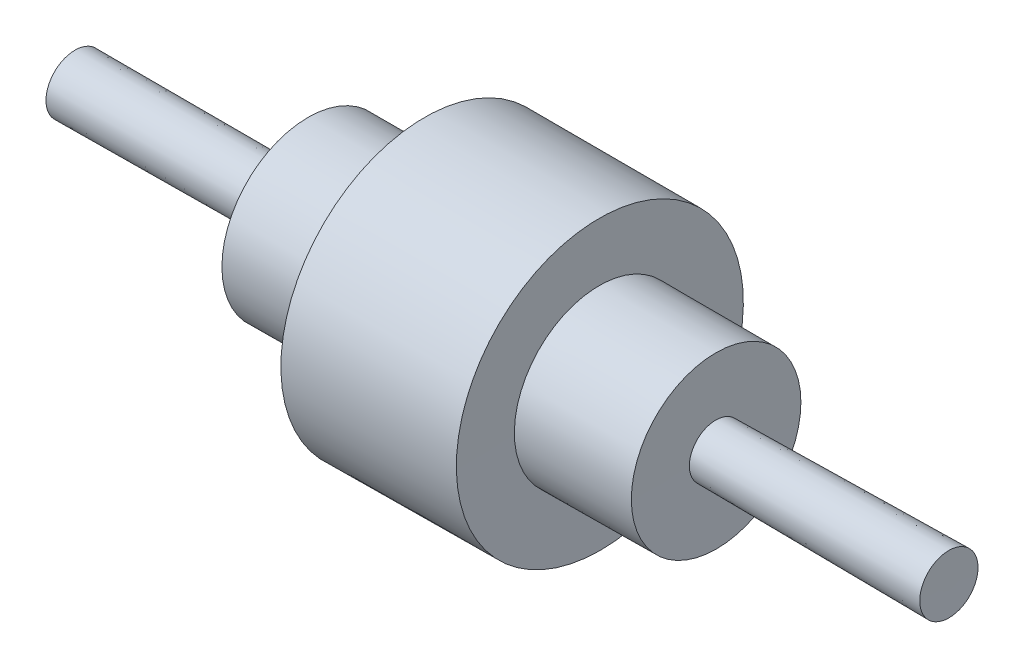
ISO-10303-21;
HEADER;
FILE_DESCRIPTION(('STEP AP214'),'2;1');
FILE_NAME('part.step','',(''),(''),'','','');
FILE_SCHEMA(('AUTOMOTIVE_DESIGN { 1 0 10303 214 1 1 1 1 }'));
ENDSEC;
DATA;
#1=APPLICATION_CONTEXT('core data for automotive mechanical design processes');
#2=APPLICATION_PROTOCOL_DEFINITION('international standard','automotive_design',2000,#1);
#3=PRODUCT_CONTEXT('',#1,'mechanical');
#4=PRODUCT('Part','Part','',(#3));
#5=PRODUCT_RELATED_PRODUCT_CATEGORY('part','',(#4));
#6=PRODUCT_DEFINITION_FORMATION('','',#4);
#7=PRODUCT_DEFINITION_CONTEXT('part definition',#1,'design');
#8=PRODUCT_DEFINITION('design','',#6,#7);
#9=PRODUCT_DEFINITION_SHAPE('','',#8);
#10=(LENGTH_UNIT() NAMED_UNIT(*) SI_UNIT(.MILLI.,.METRE.));
#11=(NAMED_UNIT(*) PLANE_ANGLE_UNIT() SI_UNIT($,.RADIAN.));
#12=(NAMED_UNIT(*) SI_UNIT($,.STERADIAN.) SOLID_ANGLE_UNIT());
#13=UNCERTAINTY_MEASURE_WITH_UNIT(LENGTH_MEASURE(1.E-05),#10,'distance_accuracy_value','');
#14=(GEOMETRIC_REPRESENTATION_CONTEXT(3) GLOBAL_UNCERTAINTY_ASSIGNED_CONTEXT((#13)) GLOBAL_UNIT_ASSIGNED_CONTEXT((#10,
#11,#12)) REPRESENTATION_CONTEXT('',''));
#15=CARTESIAN_POINT('',(0.,0.,0.));
#16=DIRECTION('',(0.,0.,1.));
#17=DIRECTION('',(1.,0.,0.));
#18=AXIS2_PLACEMENT_3D('',#15,#16,#17);
#19=CARTESIAN_POINT('',(40.455273304278,0.163665592454998,0.));
#20=DIRECTION('',(0.999991816686894,0.00404556043651554,0.));
#21=DIRECTION('',(-0.00404556043651554,0.999991816686894,0.));
#22=AXIS2_PLACEMENT_3D('',#19,#20,#21);
#23=CONICAL_SURFACE('',#22,9999.91816686894,1.56675075532298);
#24=CARTESIAN_POINT('',(0.,0.,0.));
#25=VERTEX_POINT('',#24);
#26=VERTEX_LOOP('',#25);
#27=FACE_BOUND('',#26,.T.);
#28=CARTESIAN_POINT('',(40.455273304278,0.163665592454998,0.));
#29=DIRECTION('',(-0.999991816686894,-0.00404556043651554,0.));
#30=DIRECTION('',(0.00404556043651554,-0.999991816686894,0.));
#31=AXIS2_PLACEMENT_3D('',#28,#29,#30);
#32=CIRCLE('',#31,9999.91816686894);
#33=CARTESIAN_POINT('',(80.910546608556,-9999.67266881509,0.));
#34=VERTEX_POINT('',#33);
#35=EDGE_CURVE('E11',#34,#34,#32,.T.);
#36=ORIENTED_EDGE('',*,*,#35,.T.);
#37=EDGE_LOOP('',(#36));
#38=FACE_BOUND('',#37,.T.);
#39=ADVANCED_FACE('F43',(#27,#38),#23,.T.);
#40=CARTESIAN_POINT('',(80039.1459485646,323.805852026679,0.));
#41=DIRECTION('',(-0.999991816686894,-0.00404556043651554,0.));
#42=DIRECTION('',(0.00404556043651554,-0.999991816686894,0.));
#43=AXIS2_PLACEMENT_3D('',#40,#41,#42);
#44=CONICAL_SURFACE('',#43,9676.2733319477,0.00404557147191424);
#45=ORIENTED_EDGE('',*,*,#35,.F.);
#46=EDGE_LOOP('',(#45));
#47=FACE_BOUND('',#46,.T.);
#48=CARTESIAN_POINT('',(80039.1459485646,323.805852026679,0.));
#49=DIRECTION('',(-0.999991816686894,-0.00404556043651554,0.));
#50=DIRECTION('',(0.00404556043651554,-0.999991816686894,0.));
#51=AXIS2_PLACEMENT_3D('',#48,#49,#50);
#52=CIRCLE('',#51,9676.2733319477);
#53=CARTESIAN_POINT('',(80000.,9999.99999999997,0.));
#54=VERTEX_POINT('',#53);
#55=EDGE_CURVE('E51',#54,#54,#52,.T.);
#56=ORIENTED_EDGE('',*,*,#55,.T.);
#57=EDGE_LOOP('',(#56));
#58=FACE_BOUND('',#57,.T.);
#59=ADVANCED_FACE('F70',(#47,#58),#44,.T.);
#60=CARTESIAN_POINT('',(80120.0564951732,324.133183211589,0.));
#61=DIRECTION('',(0.999991816686894,0.00404556043651554,0.));
#62=DIRECTION('',(-0.00404556043651554,0.999991816686894,0.));
#63=AXIS2_PLACEMENT_3D('',#60,#61,#62);
#64=CONICAL_SURFACE('',#63,29676.1096656856,1.56675075532298);
#65=CARTESIAN_POINT('',(80120.0564951732,324.133183211589,0.));
#66=DIRECTION('',(-0.999991816686894,-0.00404556043651554,0.));
#67=DIRECTION('',(0.00404556043651554,-0.999991816686894,0.));
#68=AXIS2_PLACEMENT_3D('',#65,#66,#67);
#69=CIRCLE('',#68,29676.1096656856);
#70=CARTESIAN_POINT('',(80000.,30000.0000000018,0.));
#71=VERTEX_POINT('',#70);
#72=EDGE_CURVE('E83',#71,#71,#69,.T.);
#73=CARTESIAN_POINT('',(80000.,9999.99999999997,0.));
#74=CARTESIAN_POINT('',(80000.,10208.3333333333,0.));
#75=CARTESIAN_POINT('',(80000.,10416.6666666667,0.));
#76=CARTESIAN_POINT('',(80000.,10833.3333333334,0.));
#77=CARTESIAN_POINT('',(80000.,11041.6666666667,0.));
#78=CARTESIAN_POINT('',(80000.,11458.3333333334,0.));
#79=CARTESIAN_POINT('',(80000.,11666.6666666668,0.));
#80=CARTESIAN_POINT('',(80000.,12083.3333333335,0.));
#81=CARTESIAN_POINT('',(80000.,12291.6666666668,0.));
#82=CARTESIAN_POINT('',(80000.,12708.3333333335,0.));
#83=CARTESIAN_POINT('',(80000.,12916.6666666669,0.));
#84=CARTESIAN_POINT('',(80000.,13333.3333333336,0.));
#85=CARTESIAN_POINT('',(80000.,13541.666666667,0.));
#86=CARTESIAN_POINT('',(80000.,13958.3333333337,0.));
#87=CARTESIAN_POINT('',(80000.,14166.666666667,0.));
#88=CARTESIAN_POINT('',(80000.,14583.3333333337,0.));
#89=CARTESIAN_POINT('',(80000.,14791.6666666671,0.));
#90=CARTESIAN_POINT('',(80000.,15208.3333333338,0.));
#91=CARTESIAN_POINT('',(80000.,15416.6666666671,0.));
#92=CARTESIAN_POINT('',(80000.,15833.3333333338,0.));
#93=CARTESIAN_POINT('',(80000.,16041.6666666672,0.));
#94=CARTESIAN_POINT('',(80000.,16458.3333333339,0.));
#95=CARTESIAN_POINT('',(80000.,16666.6666666672,0.));
#96=CARTESIAN_POINT('',(80000.,17083.3333333339,0.));
#97=CARTESIAN_POINT('',(80000.,17291.6666666673,0.));
#98=CARTESIAN_POINT('',(80000.,17708.333333334,0.));
#99=CARTESIAN_POINT('',(80000.,17916.6666666673,0.));
#100=CARTESIAN_POINT('',(80000.,18333.333333334,0.));
#101=CARTESIAN_POINT('',(80000.,18541.6666666674,0.));
#102=CARTESIAN_POINT('',(80000.,18958.3333333341,0.));
#103=CARTESIAN_POINT('',(80000.,19166.6666666675,0.));
#104=CARTESIAN_POINT('',(80000.,19583.3333333342,0.));
#105=CARTESIAN_POINT('',(80000.,19791.6666666675,0.));
#106=CARTESIAN_POINT('',(80000.,20208.3333333342,0.));
#107=CARTESIAN_POINT('',(80000.,20416.6666666676,0.));
#108=CARTESIAN_POINT('',(80000.,20833.3333333343,0.));
#109=CARTESIAN_POINT('',(80000.,21041.6666666676,0.));
#110=CARTESIAN_POINT('',(80000.,21458.3333333343,0.));
#111=CARTESIAN_POINT('',(80000.,21666.6666666677,0.));
#112=CARTESIAN_POINT('',(80000.,22083.3333333344,0.));
#113=CARTESIAN_POINT('',(80000.,22291.6666666677,0.));
#114=CARTESIAN_POINT('',(80000.,22708.3333333344,0.));
#115=CARTESIAN_POINT('',(80000.,22916.6666666678,0.));
#116=CARTESIAN_POINT('',(80000.,23333.3333333345,0.));
#117=CARTESIAN_POINT('',(80000.,23541.6666666678,0.));
#118=CARTESIAN_POINT('',(80000.,23958.3333333346,0.));
#119=CARTESIAN_POINT('',(80000.,24166.6666666679,0.));
#120=CARTESIAN_POINT('',(80000.,24583.3333333346,0.));
#121=CARTESIAN_POINT('',(80000.,24791.666666668,0.));
#122=CARTESIAN_POINT('',(80000.,25208.3333333347,0.));
#123=CARTESIAN_POINT('',(80000.,25416.666666668,0.));
#124=CARTESIAN_POINT('',(80000.,25833.3333333347,0.));
#125=CARTESIAN_POINT('',(80000.,26041.6666666681,0.));
#126=CARTESIAN_POINT('',(80000.,26458.3333333348,0.));
#127=CARTESIAN_POINT('',(80000.,26666.6666666681,0.));
#128=CARTESIAN_POINT('',(80000.,27083.3333333348,0.));
#129=CARTESIAN_POINT('',(80000.,27291.6666666682,0.));
#130=CARTESIAN_POINT('',(80000.,27708.3333333349,0.));
#131=CARTESIAN_POINT('',(80000.,27916.6666666682,0.));
#132=CARTESIAN_POINT('',(80000.,28333.3333333349,0.));
#133=CARTESIAN_POINT('',(80000.,28541.6666666683,0.));
#134=CARTESIAN_POINT('',(80000.,28958.333333335,0.));
#135=CARTESIAN_POINT('',(80000.,29166.6666666683,0.));
#136=CARTESIAN_POINT('',(80000.,29583.3333333351,0.));
#137=CARTESIAN_POINT('',(80000.,29791.6666666684,0.));
#138=CARTESIAN_POINT('',(80000.,30000.0000000018,0.));
#139=B_SPLINE_CURVE_WITH_KNOTS('',3,(#73,#74,#75,#76,#77,#78,#79,#80,#81,#82,#83,#84,#85,#86,
#87,#88,#89,#90,#91,#92,#93,#94,#95,#96,#97,#98,#99,#100,#101,#102,#103,#104,#105,#106,#107,
#108,#109,#110,#111,#112,#113,#114,#115,#116,#117,#118,#119,#120,#121,#122,#123,#124,#125,#126,
#127,#128,#129,#130,#131,#132,#133,#134,#135,#136,#137,#138),.UNSPECIFIED.,.F.,.F.,(4,2,2,2,2,2,
2,2,2,2,2,2,2,2,2,2,2,2,2,2,2,2,2,2,2,2,2,2,2,2,2,2,4),(0.,625.000000000053,1250.00000000011,
1875.00000000017,2500.00000000022,3125.00000000028,3750.00000000033,4375.00000000039,
5000.00000000044,5625.0000000005,6250.00000000055,6875.00000000061,7500.00000000066,
8125.00000000072,8750.00000000077,9375.00000000083,10000.0000000009,10625.0000000009,
11250.000000001,11875.0000000011,12500.0000000011,13125.0000000012,13750.0000000012,
14375.0000000013,15000.0000000013,15625.0000000014,16250.0000000014,16875.0000000015,
17500.0000000016,18125.0000000016,18750.0000000017,19375.0000000017,20000.0000000018),.UNSPECIFIED.);
#140=EDGE_CURVE('BSEAM74',#54,#71,#139,.T.);
#141=ORIENTED_EDGE('',*,*,#55,.F.);
#142=ORIENTED_EDGE('',*,*,#72,.T.);
#143=ORIENTED_EDGE('',*,*,#140,.T.);
#144=ORIENTED_EDGE('',*,*,#140,.F.);
#145=EDGE_LOOP('',(#141,#143,#142,#144));
#146=FACE_BOUND('',#145,.T.);
#147=ADVANCED_FACE('F74',(#146),#64,.T.);
#148=CARTESIAN_POINT('',(120119.401832803,485.954276428701,0.));
#149=DIRECTION('',(-0.999991816686894,-0.00404556043651554,0.));
#150=DIRECTION('',(0.00404556043651554,-0.999991816686894,0.));
#151=AXIS2_PLACEMENT_3D('',#148,#149,#150);
#152=CONICAL_SURFACE('',#151,29514.287248225,0.0040455714719142);
#153=ORIENTED_EDGE('',*,*,#72,.F.);
#154=EDGE_LOOP('',(#153));
#155=FACE_BOUND('',#154,.T.);
#156=CARTESIAN_POINT('',(120119.401832803,485.954276428701,0.));
#157=DIRECTION('',(-0.999991816686894,-0.00404556043651554,0.));
#158=DIRECTION('',(0.00404556043651554,-0.999991816686894,0.));
#159=AXIS2_PLACEMENT_3D('',#156,#157,#158);
#160=CIRCLE('',#159,29514.287248225);
#161=CARTESIAN_POINT('',(120238.803665607,-29028.0914471426,0.));
#162=VERTEX_POINT('',#161);
#163=EDGE_CURVE('E86',#162,#162,#160,.T.);
#164=ORIENTED_EDGE('',*,*,#163,.T.);
#165=EDGE_LOOP('',(#164));
#166=FACE_BOUND('',#165,.T.);
#167=ADVANCED_FACE('F140',(#155,#166),#152,.T.);
#168=CARTESIAN_POINT('',(120200.312379412,486.281607613611,0.));
#169=DIRECTION('',(0.999991816686894,0.00404556043651554,0.));
#170=DIRECTION('',(-0.00404556043651554,0.999991816686894,0.));
#171=AXIS2_PLACEMENT_3D('',#168,#169,#170);
#172=CONICAL_SURFACE('',#171,49514.1235819628,1.56675075532298);
#173=ORIENTED_EDGE('',*,*,#163,.F.);
#174=EDGE_LOOP('',(#173));
#175=FACE_BOUND('',#174,.T.);
#176=CARTESIAN_POINT('',(120200.312379412,486.281607613611,0.));
#177=DIRECTION('',(-0.999991816686894,-0.00404556043651554,0.));
#178=DIRECTION('',(0.00404556043651554,-0.999991816686894,0.));
#179=AXIS2_PLACEMENT_3D('',#176,#177,#178);
#180=CIRCLE('',#179,49514.1235819628);
#181=CARTESIAN_POINT('',(120400.624758824,-49027.4367847728,0.));
#182=VERTEX_POINT('',#181);
#183=EDGE_CURVE('E92',#182,#182,#180,.T.);
#184=ORIENTED_EDGE('',*,*,#183,.T.);
#185=EDGE_LOOP('',(#184));
#186=FACE_BOUND('',#185,.T.);
#187=ADVANCED_FACE('F136',(#175,#186),#172,.T.);
#188=CARTESIAN_POINT('',(180199.330385857,729.013247439279,0.));
#189=DIRECTION('',(-0.999991816686894,-0.00404556043651554,0.));
#190=DIRECTION('',(0.00404556043651554,-0.999991816686894,0.));
#191=AXIS2_PLACEMENT_3D('',#188,#189,#190);
#192=CONICAL_SURFACE('',#191,49271.3899557719,0.00404557147191414);
#193=ORIENTED_EDGE('',*,*,#183,.F.);
#194=EDGE_LOOP('',(#193));
#195=FACE_BOUND('',#194,.T.);
#196=CARTESIAN_POINT('',(180199.330385857,729.013247439279,0.));
#197=DIRECTION('',(-0.999991816686894,-0.00404556043651554,0.));
#198=DIRECTION('',(0.00404556043651554,-0.999991816686894,0.));
#199=AXIS2_PLACEMENT_3D('',#196,#197,#198);
#200=CIRCLE('',#199,49271.3899557719);
#201=CARTESIAN_POINT('',(180398.660771714,-48541.9735051214,0.));
#202=VERTEX_POINT('',#201);
#203=EDGE_CURVE('E96',#202,#202,#200,.T.);
#204=ORIENTED_EDGE('',*,*,#203,.T.);
#205=EDGE_LOOP('',(#204));
#206=FACE_BOUND('',#205,.T.);
#207=ADVANCED_FACE('F132',(#195,#206),#192,.T.);
#208=CARTESIAN_POINT('',(180118.419839249,728.685916254369,0.));
#209=DIRECTION('',(0.999991816686894,0.00404556043651554,0.));
#210=DIRECTION('',(-0.00404556043651554,0.999991816686894,0.));
#211=AXIS2_PLACEMENT_3D('',#208,#209,#210);
#212=CONICAL_SURFACE('',#211,29271.553622034,1.56675075532298);
#213=ORIENTED_EDGE('',*,*,#203,.F.);
#214=EDGE_LOOP('',(#213));
#215=FACE_BOUND('',#214,.T.);
#216=CARTESIAN_POINT('',(180118.419839249,728.685916254369,0.));
#217=DIRECTION('',(-0.999991816686894,-0.00404556043651554,0.));
#218=DIRECTION('',(0.00404556043651554,-0.999991816686894,0.));
#219=AXIS2_PLACEMENT_3D('',#216,#217,#218);
#220=CIRCLE('',#219,29271.553622034);
#221=CARTESIAN_POINT('',(180236.839678497,-28542.6281674913,0.));
#222=VERTEX_POINT('',#221);
#223=EDGE_CURVE('E100',#222,#222,#220,.T.);
#224=ORIENTED_EDGE('',*,*,#223,.T.);
#225=EDGE_LOOP('',(#224));
#226=FACE_BOUND('',#225,.T.);
#227=ADVANCED_FACE('F125',(#215,#226),#212,.F.);
#228=CARTESIAN_POINT('',(220117.765176879,890.507009471481,0.));
#229=DIRECTION('',(-0.999991816686894,-0.00404556043651554,0.));
#230=DIRECTION('',(0.00404556043651554,-0.999991816686894,0.));
#231=AXIS2_PLACEMENT_3D('',#228,#229,#230);
#232=CONICAL_SURFACE('',#231,29109.7312045734,0.00404557147191419);
#233=ORIENTED_EDGE('',*,*,#223,.F.);
#234=EDGE_LOOP('',(#233));
#235=FACE_BOUND('',#234,.T.);
#236=CARTESIAN_POINT('',(220117.765176879,890.507009471481,0.));
#237=DIRECTION('',(-0.999991816686894,-0.00404556043651554,0.));
#238=DIRECTION('',(0.00404556043651554,-0.999991816686894,0.));
#239=AXIS2_PLACEMENT_3D('',#236,#237,#238);
#240=CIRCLE('',#239,29109.7312045734);
#241=CARTESIAN_POINT('',(220000.,30000.0000000024,0.));
#242=VERTEX_POINT('',#241);
#243=EDGE_CURVE('E104',#242,#242,#240,.T.);
#244=ORIENTED_EDGE('',*,*,#243,.T.);
#245=EDGE_LOOP('',(#244));
#246=FACE_BOUND('',#245,.T.);
#247=ADVANCED_FACE('F119',(#235,#246),#232,.T.);
#248=CARTESIAN_POINT('',(220036.85463027,890.179678286571,0.));
#249=DIRECTION('',(0.999991816686894,0.00404556043651554,0.));
#250=DIRECTION('',(-0.00404556043651554,0.999991816686894,0.));
#251=AXIS2_PLACEMENT_3D('',#248,#249,#250);
#252=CONICAL_SURFACE('',#251,9109.89487083552,1.56675075532298);
#253=CARTESIAN_POINT('',(220036.85463027,890.179678286571,0.));
#254=DIRECTION('',(-0.999991816686894,-0.00404556043651554,0.));
#255=DIRECTION('',(0.00404556043651554,-0.999991816686894,0.));
#256=AXIS2_PLACEMENT_3D('',#253,#254,#255);
#257=CIRCLE('',#256,9109.89487083552);
#258=CARTESIAN_POINT('',(220000.,10000.0000000035,0.));
#259=VERTEX_POINT('',#258);
#260=EDGE_CURVE('E108',#259,#259,#257,.T.);
#261=CARTESIAN_POINT('',(220000.,30000.0000000024,0.));
#262=CARTESIAN_POINT('',(220000.,29791.6666666691,0.));
#263=CARTESIAN_POINT('',(220000.,29583.3333333357,0.));
#264=CARTESIAN_POINT('',(220000.,29166.6666666691,0.));
#265=CARTESIAN_POINT('',(220000.,28958.3333333358,0.));
#266=CARTESIAN_POINT('',(220000.,28541.6666666691,0.));
#267=CARTESIAN_POINT('',(220000.,28333.3333333358,0.));
#268=CARTESIAN_POINT('',(220000.,27916.6666666692,0.));
#269=CARTESIAN_POINT('',(220000.,27708.3333333358,0.));
#270=CARTESIAN_POINT('',(220000.,27291.6666666692,0.));
#271=CARTESIAN_POINT('',(220000.,27083.3333333359,0.));
#272=CARTESIAN_POINT('',(220000.,26666.6666666692,0.));
#273=CARTESIAN_POINT('',(220000.,26458.3333333359,0.));
#274=CARTESIAN_POINT('',(220000.,26041.6666666693,0.));
#275=CARTESIAN_POINT('',(220000.,25833.333333336,0.));
#276=CARTESIAN_POINT('',(220000.,25416.6666666693,0.));
#277=CARTESIAN_POINT('',(220000.,25208.333333336,0.));
#278=CARTESIAN_POINT('',(220000.,24791.6666666693,0.));
#279=CARTESIAN_POINT('',(220000.,24583.333333336,0.));
#280=CARTESIAN_POINT('',(220000.,24166.6666666694,0.));
#281=CARTESIAN_POINT('',(220000.,23958.3333333361,0.));
#282=CARTESIAN_POINT('',(220000.,23541.6666666694,0.));
#283=CARTESIAN_POINT('',(220000.,23333.3333333361,0.));
#284=CARTESIAN_POINT('',(220000.,22916.6666666695,0.));
#285=CARTESIAN_POINT('',(220000.,22708.3333333361,0.));
#286=CARTESIAN_POINT('',(220000.,22291.6666666695,0.));
#287=CARTESIAN_POINT('',(220000.,22083.3333333362,0.));
#288=CARTESIAN_POINT('',(220000.,21666.6666666695,0.));
#289=CARTESIAN_POINT('',(220000.,21458.3333333362,0.));
#290=CARTESIAN_POINT('',(220000.,21041.6666666696,0.));
#291=CARTESIAN_POINT('',(220000.,20833.3333333362,0.));
#292=CARTESIAN_POINT('',(220000.,20416.6666666696,0.));
#293=CARTESIAN_POINT('',(220000.,20208.3333333363,0.));
#294=CARTESIAN_POINT('',(220000.,19791.6666666696,0.));
#295=CARTESIAN_POINT('',(220000.,19583.3333333363,0.));
#296=CARTESIAN_POINT('',(220000.,19166.6666666697,0.));
#297=CARTESIAN_POINT('',(220000.,18958.3333333363,0.));
#298=CARTESIAN_POINT('',(220000.,18541.6666666697,0.));
#299=CARTESIAN_POINT('',(220000.,18333.3333333364,0.));
#300=CARTESIAN_POINT('',(220000.,17916.6666666697,0.));
#301=CARTESIAN_POINT('',(220000.,17708.3333333364,0.));
#302=CARTESIAN_POINT('',(220000.,17291.6666666698,0.));
#303=CARTESIAN_POINT('',(220000.,17083.3333333364,0.));
#304=CARTESIAN_POINT('',(220000.,16666.6666666698,0.));
#305=CARTESIAN_POINT('',(220000.,16458.3333333365,0.));
#306=CARTESIAN_POINT('',(220000.,16041.6666666698,0.));
#307=CARTESIAN_POINT('',(220000.,15833.3333333365,0.));
#308=CARTESIAN_POINT('',(220000.,15416.6666666699,0.));
#309=CARTESIAN_POINT('',(220000.,15208.3333333366,0.));
#310=CARTESIAN_POINT('',(220000.,14791.6666666699,0.));
#311=CARTESIAN_POINT('',(220000.,14583.3333333366,0.));
#312=CARTESIAN_POINT('',(220000.,14166.6666666699,0.));
#313=CARTESIAN_POINT('',(220000.,13958.3333333366,0.));
#314=CARTESIAN_POINT('',(220000.,13541.66666667,0.));
#315=CARTESIAN_POINT('',(220000.,13333.3333333367,0.));
#316=CARTESIAN_POINT('',(220000.,12916.66666667,0.));
#317=CARTESIAN_POINT('',(220000.,12708.3333333367,0.));
#318=CARTESIAN_POINT('',(220000.,12291.66666667,0.));
#319=CARTESIAN_POINT('',(220000.,12083.3333333367,0.));
#320=CARTESIAN_POINT('',(220000.,11666.6666666701,0.));
#321=CARTESIAN_POINT('',(220000.,11458.3333333368,0.));
#322=CARTESIAN_POINT('',(220000.,11041.6666666701,0.));
#323=CARTESIAN_POINT('',(220000.,10833.3333333368,0.));
#324=CARTESIAN_POINT('',(220000.,10416.6666666702,0.));
#325=CARTESIAN_POINT('',(220000.,10208.3333333368,0.));
#326=CARTESIAN_POINT('',(220000.,10000.0000000035,0.));
#327=B_SPLINE_CURVE_WITH_KNOTS('',3,(#261,#262,#263,#264,#265,#266,#267,#268,#269,#270,#271,
#272,#273,#274,#275,#276,#277,#278,#279,#280,#281,#282,#283,#284,#285,#286,#287,#288,#289,#290,
#291,#292,#293,#294,#295,#296,#297,#298,#299,#300,#301,#302,#303,#304,#305,#306,#307,#308,#309,
#310,#311,#312,#313,#314,#315,#316,#317,#318,#319,#320,#321,#322,#323,#324,#325,#326),
.UNSPECIFIED.,.F.,.F.,(4,2,2,2,2,2,2,2,2,2,2,2,2,2,2,2,2,2,2,2,2,2,2,2,2,2,2,2,2,2,2,2,4),(0.,
624.999999999968,1249.99999999993,1874.99999999989,2499.99999999986,3124.99999999982,
3749.99999999979,4374.99999999975,4999.99999999972,5624.99999999969,6249.99999999965,
6874.99999999962,7499.99999999958,8124.99999999954,8749.99999999951,9374.99999999947,
9999.99999999944,10624.9999999994,11249.9999999994,11874.9999999993,12499.9999999993,
13124.9999999993,13749.9999999992,14374.9999999992,14999.9999999992,15624.9999999991,
16249.9999999991,16874.999999999,17499.999999999,18124.999999999,18749.9999999989,
19374.9999999989,19999.9999999989),.UNSPECIFIED.);
#328=EDGE_CURVE('BSEAM65',#242,#259,#327,.T.);
#329=ORIENTED_EDGE('',*,*,#243,.F.);
#330=ORIENTED_EDGE('',*,*,#260,.T.);
#331=ORIENTED_EDGE('',*,*,#328,.T.);
#332=ORIENTED_EDGE('',*,*,#328,.F.);
#333=EDGE_LOOP('',(#329,#331,#330,#332));
#334=FACE_BOUND('',#333,.T.);
#335=ADVANCED_FACE('F65',(#334),#252,.F.);
#336=CARTESIAN_POINT('',(300031.248968361,1213.80448348688,0.));
#337=DIRECTION('',(0.999991816686894,0.00404556043651554,0.));
#338=DIRECTION('',(-0.00404556043651554,0.999991816686894,0.));
#339=AXIS2_PLACEMENT_3D('',#336,#337,#338);
#340=CONICAL_SURFACE('',#339,9999.91816686894,0.0111255207133184);
#341=ORIENTED_EDGE('',*,*,#260,.F.);
#342=EDGE_LOOP('',(#341));
#343=FACE_BOUND('',#342,.T.);
#344=CARTESIAN_POINT('',(300031.248968361,1213.80448348688,0.));
#345=DIRECTION('',(-0.999991816686894,-0.00404556043651554,0.));
#346=DIRECTION('',(0.00404556043651554,-0.999991816686894,0.));
#347=AXIS2_PLACEMENT_3D('',#344,#345,#346);
#348=CIRCLE('',#347,9999.91816686894);
#349=CARTESIAN_POINT('',(300071.704241665,-8786.03185092066,0.));
#350=VERTEX_POINT('',#349);
#351=EDGE_CURVE('E112',#350,#350,#348,.T.);
#352=ORIENTED_EDGE('',*,*,#351,.T.);
#353=EDGE_LOOP('',(#352));
#354=FACE_BOUND('',#353,.T.);
#355=ADVANCED_FACE('F59',(#343,#354),#340,.T.);
#356=CARTESIAN_POINT('',(299990.793695057,1213.64081789443,0.));
#357=DIRECTION('',(0.999991816686894,0.00404556043651554,0.));
#358=DIRECTION('',(-0.00404556043651554,0.999991816686894,0.));
#359=AXIS2_PLACEMENT_3D('',#356,#357,#358);
#360=CONICAL_SURFACE('',#359,0.,1.56675075532298);
#361=ORIENTED_EDGE('',*,*,#351,.F.);
#362=EDGE_LOOP('',(#361));
#363=FACE_BOUND('',#362,.T.);
#364=CARTESIAN_POINT('',(299990.793695057,1213.64081789443,0.));
#365=VERTEX_POINT('',#364);
#366=VERTEX_LOOP('',#365);
#367=FACE_BOUND('',#366,.T.);
#368=ADVANCED_FACE('F57',(#363,#367),#360,.F.);
#369=CLOSED_SHELL('',(#39,#59,#147,#167,#187,#207,#227,#247,#335,#355,#368));
#370=MANIFOLD_SOLID_BREP('B2',#369);
#371=ADVANCED_BREP_SHAPE_REPRESENTATION('',(#18,#370),#14);
#372=SHAPE_DEFINITION_REPRESENTATION(#9,#371);
ENDSEC;
END-ISO-10303-21;
